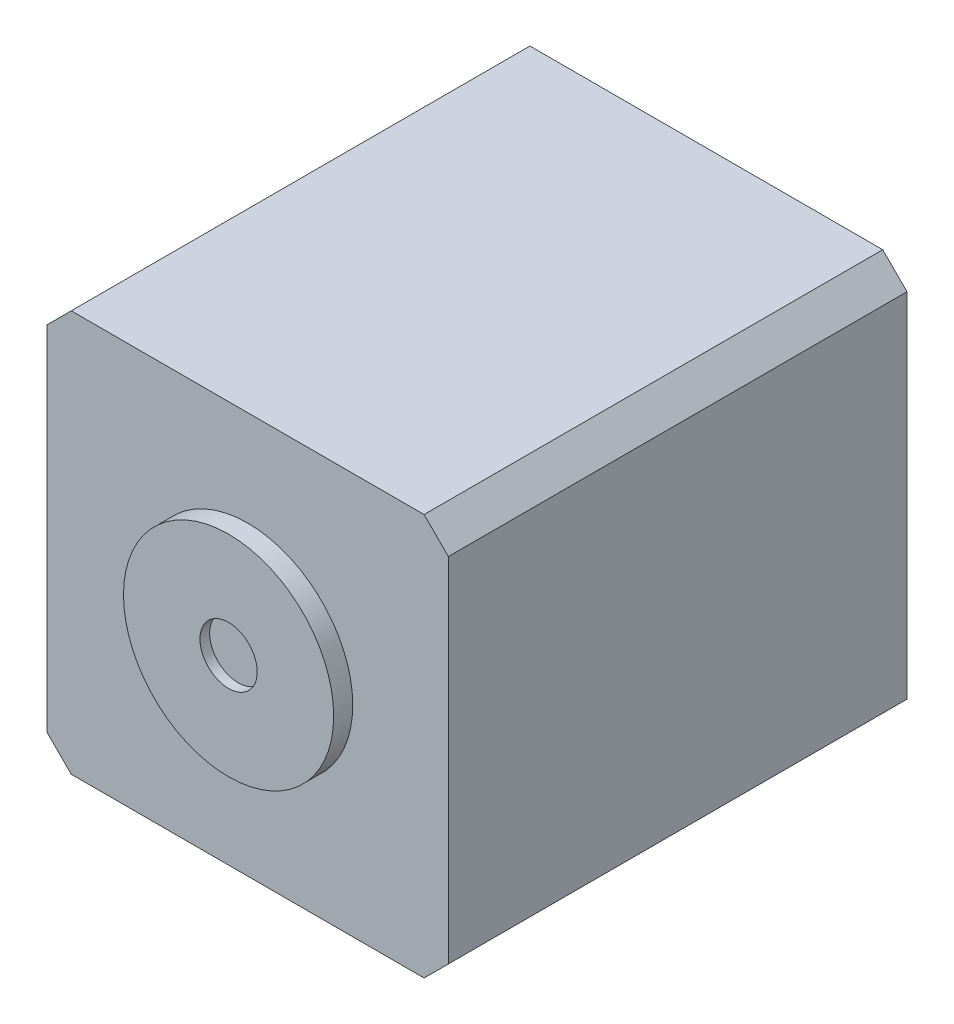
ISO-10303-21;
HEADER;
FILE_DESCRIPTION(('STEP AP214'),'2;1');
FILE_NAME('part.step','',(''),(''),'','','');
FILE_SCHEMA(('AUTOMOTIVE_DESIGN { 1 0 10303 214 1 1 1 1 }'));
ENDSEC;
DATA;
#1=APPLICATION_CONTEXT('core data for automotive mechanical design processes');
#2=APPLICATION_PROTOCOL_DEFINITION('international standard','automotive_design',2000,#1);
#3=PRODUCT_CONTEXT('',#1,'mechanical');
#4=PRODUCT('Part','Part','',(#3));
#5=PRODUCT_RELATED_PRODUCT_CATEGORY('part','',(#4));
#6=PRODUCT_DEFINITION_FORMATION('','',#4);
#7=PRODUCT_DEFINITION_CONTEXT('part definition',#1,'design');
#8=PRODUCT_DEFINITION('design','',#6,#7);
#9=PRODUCT_DEFINITION_SHAPE('','',#8);
#10=(LENGTH_UNIT() NAMED_UNIT(*) SI_UNIT(.MILLI.,.METRE.));
#11=(NAMED_UNIT(*) PLANE_ANGLE_UNIT() SI_UNIT($,.RADIAN.));
#12=(NAMED_UNIT(*) SI_UNIT($,.STERADIAN.) SOLID_ANGLE_UNIT());
#13=UNCERTAINTY_MEASURE_WITH_UNIT(LENGTH_MEASURE(1.E-05),#10,'distance_accuracy_value','');
#14=(GEOMETRIC_REPRESENTATION_CONTEXT(3) GLOBAL_UNCERTAINTY_ASSIGNED_CONTEXT((#13)) GLOBAL_UNIT_ASSIGNED_CONTEXT((#10,
#11,#12)) REPRESENTATION_CONTEXT('',''));
#15=CARTESIAN_POINT('',(0.,0.,0.));
#16=DIRECTION('',(0.,0.,1.));
#17=DIRECTION('',(1.,0.,0.));
#18=AXIS2_PLACEMENT_3D('',#15,#16,#17);
#19=CARTESIAN_POINT('',(-21.0058,-21.0058,48.006));
#20=DIRECTION('',(1.,0.,0.));
#21=DIRECTION('',(0.,0.,-1.));
#22=AXIS2_PLACEMENT_3D('',#19,#20,#21);
#23=PLANE('',#22);
#24=DIRECTION('',(0.,-1.,0.));
#25=VECTOR('',#24,1.);
#26=CARTESIAN_POINT('',(-21.0058,-21.0058,0.));
#27=LINE('',#26,#25);
#28=CARTESIAN_POINT('',(-21.0058,18.4658,0.));
#29=VERTEX_POINT('',#28);
#30=CARTESIAN_POINT('',(-21.0058,-18.4658,0.));
#31=VERTEX_POINT('',#30);
#32=EDGE_CURVE('E141',#29,#31,#27,.T.);
#33=ORIENTED_EDGE('',*,*,#32,.T.);
#34=DIRECTION('',(0.,0.,1.));
#35=VECTOR('',#34,1.);
#36=CARTESIAN_POINT('',(-21.0058,-18.4658,48.006));
#37=LINE('',#36,#35);
#38=CARTESIAN_POINT('',(-21.0058,-18.4658,48.006));
#39=VERTEX_POINT('',#38);
#40=EDGE_CURVE('E163',#31,#39,#37,.T.);
#41=ORIENTED_EDGE('',*,*,#40,.T.);
#42=DIRECTION('',(0.,-1.,0.));
#43=VECTOR('',#42,1.);
#44=CARTESIAN_POINT('',(-21.0058,-21.0058,48.006));
#45=LINE('',#44,#43);
#46=CARTESIAN_POINT('',(-21.0058,18.4658,48.006));
#47=VERTEX_POINT('',#46);
#48=EDGE_CURVE('E139',#47,#39,#45,.T.);
#49=ORIENTED_EDGE('',*,*,#48,.F.);
#50=DIRECTION('',(0.,0.,-1.));
#51=VECTOR('',#50,1.);
#52=CARTESIAN_POINT('',(-21.0058,18.4658,48.006));
#53=LINE('',#52,#51);
#54=EDGE_CURVE('E160',#47,#29,#53,.T.);
#55=ORIENTED_EDGE('',*,*,#54,.T.);
#56=EDGE_LOOP('',(#33,#41,#49,#55));
#57=FACE_BOUND('',#56,.T.);
#58=ADVANCED_FACE('F41',(#57),#23,.F.);
#59=CARTESIAN_POINT('',(21.0058,-21.0058,48.006));
#60=DIRECTION('',(0.,1.,0.));
#61=DIRECTION('',(-1.,0.,0.));
#62=AXIS2_PLACEMENT_3D('',#59,#60,#61);
#63=PLANE('',#62);
#64=DIRECTION('',(1.,0.,0.));
#65=VECTOR('',#64,1.);
#66=CARTESIAN_POINT('',(21.0058,-21.0058,0.));
#67=LINE('',#66,#65);
#68=CARTESIAN_POINT('',(-18.4658,-21.0058,0.));
#69=VERTEX_POINT('',#68);
#70=CARTESIAN_POINT('',(18.4658,-21.0058,0.));
#71=VERTEX_POINT('',#70);
#72=EDGE_CURVE('E137',#69,#71,#67,.T.);
#73=ORIENTED_EDGE('',*,*,#72,.T.);
#74=DIRECTION('',(0.,0.,1.));
#75=VECTOR('',#74,1.);
#76=CARTESIAN_POINT('',(18.4658,-21.0058,48.006));
#77=LINE('',#76,#75);
#78=CARTESIAN_POINT('',(18.4658,-21.0058,48.006));
#79=VERTEX_POINT('',#78);
#80=EDGE_CURVE('E115',#71,#79,#77,.T.);
#81=ORIENTED_EDGE('',*,*,#80,.T.);
#82=DIRECTION('',(1.,0.,0.));
#83=VECTOR('',#82,1.);
#84=CARTESIAN_POINT('',(21.0058,-21.0058,48.006));
#85=LINE('',#84,#83);
#86=CARTESIAN_POINT('',(-18.4658,-21.0058,48.006));
#87=VERTEX_POINT('',#86);
#88=EDGE_CURVE('E178',#87,#79,#85,.T.);
#89=ORIENTED_EDGE('',*,*,#88,.F.);
#90=DIRECTION('',(0.,0.,-1.));
#91=VECTOR('',#90,1.);
#92=CARTESIAN_POINT('',(-18.4658,-21.0058,48.006));
#93=LINE('',#92,#91);
#94=EDGE_CURVE('E120',#87,#69,#93,.T.);
#95=ORIENTED_EDGE('',*,*,#94,.T.);
#96=EDGE_LOOP('',(#73,#81,#89,#95));
#97=FACE_BOUND('',#96,.T.);
#98=ADVANCED_FACE('F213',(#97),#63,.F.);
#99=CARTESIAN_POINT('',(21.0058,-21.0058,48.006));
#100=DIRECTION('',(-1.,0.,0.));
#101=DIRECTION('',(0.,0.,1.));
#102=AXIS2_PLACEMENT_3D('',#99,#100,#101);
#103=PLANE('',#102);
#104=DIRECTION('',(0.,1.,0.));
#105=VECTOR('',#104,1.);
#106=CARTESIAN_POINT('',(21.0058,-21.0058,48.006));
#107=LINE('',#106,#105);
#108=CARTESIAN_POINT('',(21.0058,-18.4658,48.006));
#109=VERTEX_POINT('',#108);
#110=CARTESIAN_POINT('',(21.0058,18.4658,48.006));
#111=VERTEX_POINT('',#110);
#112=EDGE_CURVE('E129',#109,#111,#107,.T.);
#113=ORIENTED_EDGE('',*,*,#112,.F.);
#114=DIRECTION('',(0.,0.,-1.));
#115=VECTOR('',#114,1.);
#116=CARTESIAN_POINT('',(21.0058,-18.4658,48.006));
#117=LINE('',#116,#115);
#118=CARTESIAN_POINT('',(21.0058,-18.4658,0.));
#119=VERTEX_POINT('',#118);
#120=EDGE_CURVE('E114',#109,#119,#117,.T.);
#121=ORIENTED_EDGE('',*,*,#120,.T.);
#122=DIRECTION('',(0.,1.,0.));
#123=VECTOR('',#122,1.);
#124=CARTESIAN_POINT('',(21.0058,-21.0058,0.));
#125=LINE('',#124,#123);
#126=CARTESIAN_POINT('',(21.0058,18.4658,0.));
#127=VERTEX_POINT('',#126);
#128=EDGE_CURVE('E127',#119,#127,#125,.T.);
#129=ORIENTED_EDGE('',*,*,#128,.T.);
#130=DIRECTION('',(0.,0.,1.));
#131=VECTOR('',#130,1.);
#132=CARTESIAN_POINT('',(21.0058,18.4658,48.006));
#133=LINE('',#132,#131);
#134=EDGE_CURVE('E131',#127,#111,#133,.T.);
#135=ORIENTED_EDGE('',*,*,#134,.T.);
#136=EDGE_LOOP('',(#113,#121,#129,#135));
#137=FACE_BOUND('',#136,.T.);
#138=ADVANCED_FACE('F126',(#137),#103,.F.);
#139=CARTESIAN_POINT('',(21.0058,21.0058,48.006));
#140=DIRECTION('',(0.,-1.,0.));
#141=DIRECTION('',(1.,0.,0.));
#142=AXIS2_PLACEMENT_3D('',#139,#140,#141);
#143=PLANE('',#142);
#144=DIRECTION('',(-1.,0.,0.));
#145=VECTOR('',#144,1.);
#146=CARTESIAN_POINT('',(21.0058,21.0058,48.006));
#147=LINE('',#146,#145);
#148=CARTESIAN_POINT('',(18.4658,21.0058,48.006));
#149=VERTEX_POINT('',#148);
#150=CARTESIAN_POINT('',(-18.4658,21.0058,48.006));
#151=VERTEX_POINT('',#150);
#152=EDGE_CURVE('E145',#149,#151,#147,.T.);
#153=ORIENTED_EDGE('',*,*,#152,.F.);
#154=DIRECTION('',(0.,0.,-1.));
#155=VECTOR('',#154,1.);
#156=CARTESIAN_POINT('',(18.4658,21.0058,48.006));
#157=LINE('',#156,#155);
#158=CARTESIAN_POINT('',(18.4658,21.0058,0.));
#159=VERTEX_POINT('',#158);
#160=EDGE_CURVE('E46',#149,#159,#157,.T.);
#161=ORIENTED_EDGE('',*,*,#160,.T.);
#162=DIRECTION('',(-1.,0.,0.));
#163=VECTOR('',#162,1.);
#164=CARTESIAN_POINT('',(21.0058,21.0058,0.));
#165=LINE('',#164,#163);
#166=CARTESIAN_POINT('',(-18.4658,21.0058,0.));
#167=VERTEX_POINT('',#166);
#168=EDGE_CURVE('E136',#159,#167,#165,.T.);
#169=ORIENTED_EDGE('',*,*,#168,.T.);
#170=DIRECTION('',(0.,0.,1.));
#171=VECTOR('',#170,1.);
#172=CARTESIAN_POINT('',(-18.4658,21.0058,48.006));
#173=LINE('',#172,#171);
#174=EDGE_CURVE('E58',#167,#151,#173,.T.);
#175=ORIENTED_EDGE('',*,*,#174,.T.);
#176=EDGE_LOOP('',(#153,#161,#169,#175));
#177=FACE_BOUND('',#176,.T.);
#178=ADVANCED_FACE('F166',(#177),#143,.F.);
#179=CARTESIAN_POINT('',(0.,0.,48.006));
#180=DIRECTION('',(0.,0.,1.));
#181=DIRECTION('',(1.,0.,0.));
#182=AXIS2_PLACEMENT_3D('',#179,#180,#181);
#183=PLANE('',#182);
#184=CARTESIAN_POINT('',(0.,0.,48.006));
#185=DIRECTION('',(0.,0.,1.));
#186=DIRECTION('',(1.,0.,0.));
#187=AXIS2_PLACEMENT_3D('',#184,#185,#186);
#188=CIRCLE('',#187,10.9982);
#189=CARTESIAN_POINT('',(10.9982,0.,48.006));
#190=VERTEX_POINT('',#189);
#191=EDGE_CURVE('E11',#190,#190,#188,.T.);
#192=ORIENTED_EDGE('',*,*,#191,.F.);
#193=EDGE_LOOP('',(#192));
#194=FACE_BOUND('',#193,.T.);
#195=ORIENTED_EDGE('',*,*,#88,.T.);
#196=DIRECTION('',(-0.707106781186548,-0.707106781186548,0.));
#197=VECTOR('',#196,1.);
#198=CARTESIAN_POINT('',(19.7358,-19.7358,48.006));
#199=LINE('',#198,#197);
#200=EDGE_CURVE('E158',#79,#109,#199,.F.);
#201=ORIENTED_EDGE('',*,*,#200,.T.);
#202=ORIENTED_EDGE('',*,*,#112,.T.);
#203=DIRECTION('',(0.707106781186546,-0.707106781186549,0.));
#204=VECTOR('',#203,1.);
#205=CARTESIAN_POINT('',(19.7358,19.7358,48.006));
#206=LINE('',#205,#204);
#207=EDGE_CURVE('E65',#111,#149,#206,.F.);
#208=ORIENTED_EDGE('',*,*,#207,.T.);
#209=ORIENTED_EDGE('',*,*,#152,.T.);
#210=DIRECTION('',(0.707106781186548,0.707106781186548,0.));
#211=VECTOR('',#210,1.);
#212=CARTESIAN_POINT('',(-19.7358,19.7358,48.006));
#213=LINE('',#212,#211);
#214=EDGE_CURVE('E153',#151,#47,#213,.F.);
#215=ORIENTED_EDGE('',*,*,#214,.T.);
#216=ORIENTED_EDGE('',*,*,#48,.T.);
#217=DIRECTION('',(-0.707106781186545,0.70710678118655,0.));
#218=VECTOR('',#217,1.);
#219=CARTESIAN_POINT('',(-19.7358000000001,-19.7357999999999,48.006));
#220=LINE('',#219,#218);
#221=EDGE_CURVE('E156',#39,#87,#220,.F.);
#222=ORIENTED_EDGE('',*,*,#221,.T.);
#223=EDGE_LOOP('',(#195,#201,#202,#208,#209,#215,#216,#222));
#224=FACE_BOUND('',#223,.T.);
#225=ADVANCED_FACE('F241',(#194,#224),#183,.T.);
#226=CARTESIAN_POINT('',(0.,0.,0.));
#227=DIRECTION('',(0.,0.,1.));
#228=DIRECTION('',(1.,0.,0.));
#229=AXIS2_PLACEMENT_3D('',#226,#227,#228);
#230=PLANE('',#229);
#231=ORIENTED_EDGE('',*,*,#128,.F.);
#232=DIRECTION('',(0.707106781186548,0.707106781186548,0.));
#233=VECTOR('',#232,1.);
#234=CARTESIAN_POINT('',(21.0058,-18.4658,0.));
#235=LINE('',#234,#233);
#236=EDGE_CURVE('E110',#119,#71,#235,.F.);
#237=ORIENTED_EDGE('',*,*,#236,.T.);
#238=ORIENTED_EDGE('',*,*,#72,.F.);
#239=DIRECTION('',(0.707106781186545,-0.70710678118655,0.));
#240=VECTOR('',#239,1.);
#241=CARTESIAN_POINT('',(-18.4658,-21.0058,0.));
#242=LINE('',#241,#240);
#243=EDGE_CURVE('E121',#69,#31,#242,.F.);
#244=ORIENTED_EDGE('',*,*,#243,.T.);
#245=ORIENTED_EDGE('',*,*,#32,.F.);
#246=DIRECTION('',(-0.707106781186548,-0.707106781186548,0.));
#247=VECTOR('',#246,1.);
#248=CARTESIAN_POINT('',(-21.0058,18.4658,0.));
#249=LINE('',#248,#247);
#250=EDGE_CURVE('E130',#29,#167,#249,.F.);
#251=ORIENTED_EDGE('',*,*,#250,.T.);
#252=ORIENTED_EDGE('',*,*,#168,.F.);
#253=DIRECTION('',(-0.707106781186546,0.707106781186549,0.));
#254=VECTOR('',#253,1.);
#255=CARTESIAN_POINT('',(18.4658,21.0058,0.));
#256=LINE('',#255,#254);
#257=EDGE_CURVE('E135',#159,#127,#256,.F.);
#258=ORIENTED_EDGE('',*,*,#257,.T.);
#259=EDGE_LOOP('',(#231,#237,#238,#244,#245,#251,#252,#258));
#260=FACE_BOUND('',#259,.T.);
#261=ADVANCED_FACE('F133',(#260),#230,.F.);
#262=CARTESIAN_POINT('',(21.0058,-18.4658,48.006));
#263=DIRECTION('',(-0.707106781186547,0.707106781186547,0.));
#264=DIRECTION('',(0.,0.,-1.));
#265=AXIS2_PLACEMENT_3D('',#262,#263,#264);
#266=PLANE('',#265);
#267=ORIENTED_EDGE('',*,*,#200,.F.);
#268=ORIENTED_EDGE('',*,*,#80,.F.);
#269=ORIENTED_EDGE('',*,*,#236,.F.);
#270=ORIENTED_EDGE('',*,*,#120,.F.);
#271=EDGE_LOOP('',(#267,#268,#269,#270));
#272=FACE_BOUND('',#271,.T.);
#273=ADVANCED_FACE('F113',(#272),#266,.F.);
#274=CARTESIAN_POINT('',(-18.4658,-21.0058,48.006));
#275=DIRECTION('',(0.70710678118655,0.707106781186545,0.));
#276=DIRECTION('',(0.,0.,-1.));
#277=AXIS2_PLACEMENT_3D('',#274,#275,#276);
#278=PLANE('',#277);
#279=ORIENTED_EDGE('',*,*,#221,.F.);
#280=ORIENTED_EDGE('',*,*,#40,.F.);
#281=ORIENTED_EDGE('',*,*,#243,.F.);
#282=ORIENTED_EDGE('',*,*,#94,.F.);
#283=EDGE_LOOP('',(#279,#280,#281,#282));
#284=FACE_BOUND('',#283,.T.);
#285=ADVANCED_FACE('F228',(#284),#278,.F.);
#286=CARTESIAN_POINT('',(18.4658,21.0058,48.006));
#287=DIRECTION('',(-0.707106781186549,-0.707106781186546,0.));
#288=DIRECTION('',(0.,0.,-1.));
#289=AXIS2_PLACEMENT_3D('',#286,#287,#288);
#290=PLANE('',#289);
#291=ORIENTED_EDGE('',*,*,#207,.F.);
#292=ORIENTED_EDGE('',*,*,#134,.F.);
#293=ORIENTED_EDGE('',*,*,#257,.F.);
#294=ORIENTED_EDGE('',*,*,#160,.F.);
#295=EDGE_LOOP('',(#291,#292,#293,#294));
#296=FACE_BOUND('',#295,.T.);
#297=ADVANCED_FACE('F233',(#296),#290,.F.);
#298=CARTESIAN_POINT('',(-21.0058,18.4658,48.006));
#299=DIRECTION('',(0.707106781186547,-0.707106781186547,0.));
#300=DIRECTION('',(0.,0.,-1.));
#301=AXIS2_PLACEMENT_3D('',#298,#299,#300);
#302=PLANE('',#301);
#303=ORIENTED_EDGE('',*,*,#214,.F.);
#304=ORIENTED_EDGE('',*,*,#174,.F.);
#305=ORIENTED_EDGE('',*,*,#250,.F.);
#306=ORIENTED_EDGE('',*,*,#54,.F.);
#307=EDGE_LOOP('',(#303,#304,#305,#306));
#308=FACE_BOUND('',#307,.T.);
#309=ADVANCED_FACE('F44',(#308),#302,.F.);
#310=CARTESIAN_POINT('',(0.,0.,50.00498));
#311=DIRECTION('',(0.,0.,-1.));
#312=DIRECTION('',(-1.,0.,0.));
#313=AXIS2_PLACEMENT_3D('',#310,#311,#312);
#314=CYLINDRICAL_SURFACE('',#313,10.9982);
#315=CARTESIAN_POINT('',(0.,0.,50.00498));
#316=DIRECTION('',(0.,0.,1.));
#317=DIRECTION('',(1.,0.,0.));
#318=AXIS2_PLACEMENT_3D('',#315,#316,#317);
#319=CIRCLE('',#318,10.9982);
#320=CARTESIAN_POINT('',(10.9982,0.,50.00498));
#321=VERTEX_POINT('',#320);
#322=EDGE_CURVE('E185',#321,#321,#319,.T.);
#323=ORIENTED_EDGE('',*,*,#322,.F.);
#324=EDGE_LOOP('',(#323));
#325=FACE_BOUND('',#324,.T.);
#326=ORIENTED_EDGE('',*,*,#191,.T.);
#327=EDGE_LOOP('',(#326));
#328=FACE_BOUND('',#327,.T.);
#329=ADVANCED_FACE('F201',(#325,#328),#314,.T.);
#330=CARTESIAN_POINT('',(0.,0.,50.00498));
#331=DIRECTION('',(0.,0.,1.));
#332=DIRECTION('',(1.,0.,0.));
#333=AXIS2_PLACEMENT_3D('',#330,#331,#332);
#334=PLANE('',#333);
#335=CARTESIAN_POINT('',(0.,0.,50.00498));
#336=DIRECTION('',(0.,0.,1.));
#337=DIRECTION('',(1.,0.,0.));
#338=AXIS2_PLACEMENT_3D('',#335,#336,#337);
#339=CIRCLE('',#338,2.9972);
#340=CARTESIAN_POINT('',(2.9972,0.,50.00498));
#341=VERTEX_POINT('',#340);
#342=EDGE_CURVE('E191',#341,#341,#339,.T.);
#343=ORIENTED_EDGE('',*,*,#342,.F.);
#344=EDGE_LOOP('',(#343));
#345=FACE_BOUND('',#344,.T.);
#346=ORIENTED_EDGE('',*,*,#322,.T.);
#347=EDGE_LOOP('',(#346));
#348=FACE_BOUND('',#347,.T.);
#349=ADVANCED_FACE('F199',(#345,#348),#334,.T.);
#350=CARTESIAN_POINT('',(0.,0.,48.98898));
#351=DIRECTION('',(0.,0.,1.));
#352=DIRECTION('',(1.,0.,0.));
#353=AXIS2_PLACEMENT_3D('',#350,#351,#352);
#354=CYLINDRICAL_SURFACE('',#353,2.9972);
#355=CARTESIAN_POINT('',(0.,0.,48.98898));
#356=DIRECTION('',(0.,0.,1.));
#357=DIRECTION('',(1.,0.,0.));
#358=AXIS2_PLACEMENT_3D('',#355,#356,#357);
#359=CIRCLE('',#358,2.9972);
#360=CARTESIAN_POINT('',(2.9972,0.,48.98898));
#361=VERTEX_POINT('',#360);
#362=EDGE_CURVE('E187',#361,#361,#359,.T.);
#363=ORIENTED_EDGE('',*,*,#362,.F.);
#364=EDGE_LOOP('',(#363));
#365=FACE_BOUND('',#364,.T.);
#366=ORIENTED_EDGE('',*,*,#342,.T.);
#367=EDGE_LOOP('',(#366));
#368=FACE_BOUND('',#367,.T.);
#369=ADVANCED_FACE('F197',(#365,#368),#354,.F.);
#370=CARTESIAN_POINT('',(0.,0.,48.98898));
#371=DIRECTION('',(0.,0.,1.));
#372=DIRECTION('',(1.,0.,0.));
#373=AXIS2_PLACEMENT_3D('',#370,#371,#372);
#374=PLANE('',#373);
#375=ORIENTED_EDGE('',*,*,#362,.T.);
#376=EDGE_LOOP('',(#375));
#377=FACE_BOUND('',#376,.T.);
#378=ADVANCED_FACE('F207',(#377),#374,.T.);
#379=CLOSED_SHELL('',(#58,#98,#138,#178,#225,#261,#273,#285,#297,#309,#329,#349,#369,#378));
#380=MANIFOLD_SOLID_BREP('B2',#379);
#381=ADVANCED_BREP_SHAPE_REPRESENTATION('',(#18,#380),#14);
#382=SHAPE_DEFINITION_REPRESENTATION(#9,#381);
ENDSEC;
END-ISO-10303-21;
